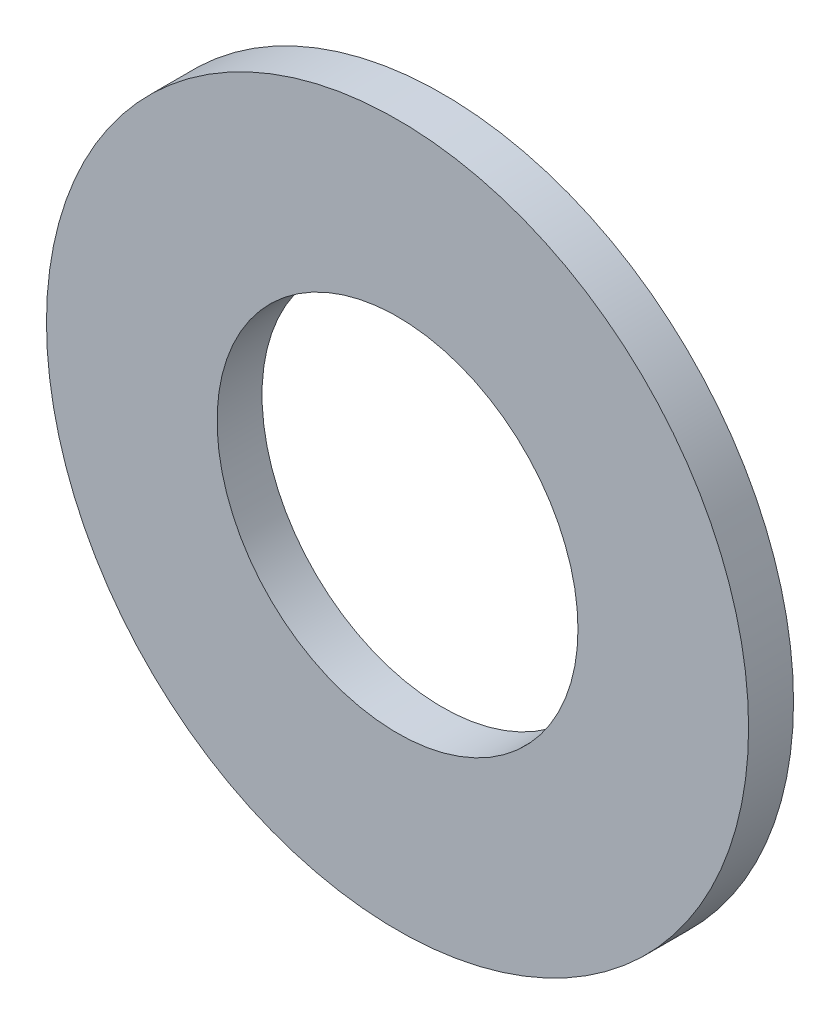
ISO-10303-21;
HEADER;
FILE_DESCRIPTION(('STEP AP214'),'2;1');
FILE_NAME('part.step','',(''),(''),'','','');
FILE_SCHEMA(('AUTOMOTIVE_DESIGN { 1 0 10303 214 1 1 1 1 }'));
ENDSEC;
DATA;
#1=APPLICATION_CONTEXT('core data for automotive mechanical design processes');
#2=APPLICATION_PROTOCOL_DEFINITION('international standard','automotive_design',2000,#1);
#3=PRODUCT_CONTEXT('',#1,'mechanical');
#4=PRODUCT('Part','Part','',(#3));
#5=PRODUCT_RELATED_PRODUCT_CATEGORY('part','',(#4));
#6=PRODUCT_DEFINITION_FORMATION('','',#4);
#7=PRODUCT_DEFINITION_CONTEXT('part definition',#1,'design');
#8=PRODUCT_DEFINITION('design','',#6,#7);
#9=PRODUCT_DEFINITION_SHAPE('','',#8);
#10=(LENGTH_UNIT() NAMED_UNIT(*) SI_UNIT(.MILLI.,.METRE.));
#11=(NAMED_UNIT(*) PLANE_ANGLE_UNIT() SI_UNIT($,.RADIAN.));
#12=(NAMED_UNIT(*) SI_UNIT($,.STERADIAN.) SOLID_ANGLE_UNIT());
#13=UNCERTAINTY_MEASURE_WITH_UNIT(LENGTH_MEASURE(1.E-05),#10,'distance_accuracy_value','');
#14=(GEOMETRIC_REPRESENTATION_CONTEXT(3) GLOBAL_UNCERTAINTY_ASSIGNED_CONTEXT((#13)) GLOBAL_UNIT_ASSIGNED_CONTEXT((#10,
#11,#12)) REPRESENTATION_CONTEXT('',''));
#15=CARTESIAN_POINT('',(0.,0.,0.));
#16=DIRECTION('',(0.,0.,1.));
#17=DIRECTION('',(1.,0.,0.));
#18=AXIS2_PLACEMENT_3D('',#15,#16,#17);
#19=CARTESIAN_POINT('',(0.,0.,0.8128));
#20=DIRECTION('',(0.,0.,-1.));
#21=DIRECTION('',(-1.,0.,0.));
#22=AXIS2_PLACEMENT_3D('',#19,#20,#21);
#23=CYLINDRICAL_SURFACE('',#22,6.35);
#24=CARTESIAN_POINT('',(0.,0.,0.8128));
#25=DIRECTION('',(0.,0.,1.));
#26=DIRECTION('',(1.,0.,0.));
#27=AXIS2_PLACEMENT_3D('',#24,#25,#26);
#28=CIRCLE('',#27,6.35);
#29=CARTESIAN_POINT('',(6.35,0.,0.8128));
#30=VERTEX_POINT('',#29);
#31=EDGE_CURVE('E10',#30,#30,#28,.T.);
#32=ORIENTED_EDGE('',*,*,#31,.F.);
#33=EDGE_LOOP('',(#32));
#34=FACE_BOUND('',#33,.T.);
#35=CARTESIAN_POINT('',(0.,0.,0.));
#36=DIRECTION('',(0.,0.,1.));
#37=DIRECTION('',(1.,0.,0.));
#38=AXIS2_PLACEMENT_3D('',#35,#36,#37);
#39=CIRCLE('',#38,6.35);
#40=CARTESIAN_POINT('',(6.35,0.,0.));
#41=VERTEX_POINT('',#40);
#42=EDGE_CURVE('E38',#41,#41,#39,.T.);
#43=ORIENTED_EDGE('',*,*,#42,.T.);
#44=EDGE_LOOP('',(#43));
#45=FACE_BOUND('',#44,.T.);
#46=ADVANCED_FACE('F35',(#34,#45),#23,.T.);
#47=CARTESIAN_POINT('',(0.,0.,0.8128));
#48=DIRECTION('',(0.,0.,1.));
#49=DIRECTION('',(1.,0.,0.));
#50=AXIS2_PLACEMENT_3D('',#47,#48,#49);
#51=PLANE('',#50);
#52=CARTESIAN_POINT('',(0.,0.,0.8128));
#53=DIRECTION('',(0.,0.,1.));
#54=DIRECTION('',(1.,0.,0.));
#55=AXIS2_PLACEMENT_3D('',#52,#53,#54);
#56=CIRCLE('',#55,3.2639);
#57=CARTESIAN_POINT('',(3.2639,0.,0.8128));
#58=VERTEX_POINT('',#57);
#59=EDGE_CURVE('E49',#58,#58,#56,.T.);
#60=ORIENTED_EDGE('',*,*,#59,.F.);
#61=EDGE_LOOP('',(#60));
#62=FACE_BOUND('',#61,.T.);
#63=ORIENTED_EDGE('',*,*,#31,.T.);
#64=EDGE_LOOP('',(#63));
#65=FACE_BOUND('',#64,.T.);
#66=ADVANCED_FACE('F55',(#62,#65),#51,.T.);
#67=CARTESIAN_POINT('',(0.,0.,0.));
#68=DIRECTION('',(0.,0.,1.));
#69=DIRECTION('',(1.,0.,0.));
#70=AXIS2_PLACEMENT_3D('',#67,#68,#69);
#71=PLANE('',#70);
#72=CARTESIAN_POINT('',(0.,0.,0.));
#73=DIRECTION('',(0.,0.,1.));
#74=DIRECTION('',(1.,0.,0.));
#75=AXIS2_PLACEMENT_3D('',#72,#73,#74);
#76=CIRCLE('',#75,3.2639);
#77=CARTESIAN_POINT('',(3.2639,0.,0.));
#78=VERTEX_POINT('',#77);
#79=EDGE_CURVE('E45',#78,#78,#76,.T.);
#80=ORIENTED_EDGE('',*,*,#79,.T.);
#81=EDGE_LOOP('',(#80));
#82=FACE_BOUND('',#81,.T.);
#83=ORIENTED_EDGE('',*,*,#42,.F.);
#84=EDGE_LOOP('',(#83));
#85=FACE_BOUND('',#84,.T.);
#86=ADVANCED_FACE('F57',(#82,#85),#71,.F.);
#87=CARTESIAN_POINT('',(0.,0.,0.8128));
#88=DIRECTION('',(0.,0.,1.));
#89=DIRECTION('',(1.,0.,0.));
#90=AXIS2_PLACEMENT_3D('',#87,#88,#89);
#91=CYLINDRICAL_SURFACE('',#90,3.2639);
#92=ORIENTED_EDGE('',*,*,#79,.F.);
#93=EDGE_LOOP('',(#92));
#94=FACE_BOUND('',#93,.T.);
#95=ORIENTED_EDGE('',*,*,#59,.T.);
#96=EDGE_LOOP('',(#95));
#97=FACE_BOUND('',#96,.T.);
#98=ADVANCED_FACE('F53',(#94,#97),#91,.F.);
#99=CLOSED_SHELL('',(#46,#66,#86,#98));
#100=MANIFOLD_SOLID_BREP('B2',#99);
#101=ADVANCED_BREP_SHAPE_REPRESENTATION('',(#18,#100),#14);
#102=SHAPE_DEFINITION_REPRESENTATION(#9,#101);
ENDSEC;
END-ISO-10303-21;
